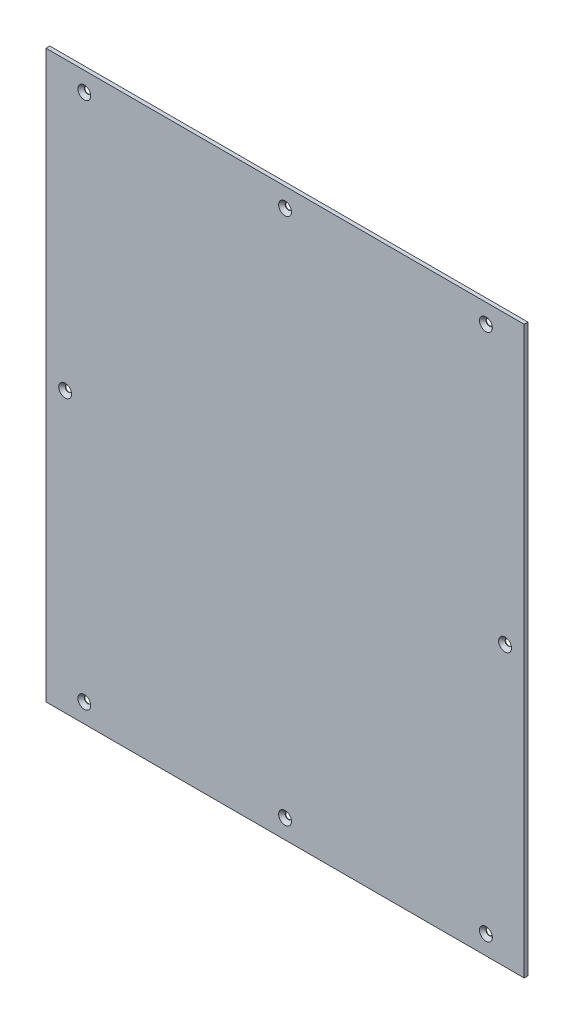
ISO-10303-21;
HEADER;
FILE_DESCRIPTION(('STEP AP214'),'2;1');
FILE_NAME('part.step','',(''),(''),'','','');
FILE_SCHEMA(('AUTOMOTIVE_DESIGN { 1 0 10303 214 1 1 1 1 }'));
ENDSEC;
DATA;
#1=APPLICATION_CONTEXT('core data for automotive mechanical design processes');
#2=APPLICATION_PROTOCOL_DEFINITION('international standard','automotive_design',2000,#1);
#3=PRODUCT_CONTEXT('',#1,'mechanical');
#4=PRODUCT('Part','Part','',(#3));
#5=PRODUCT_RELATED_PRODUCT_CATEGORY('part','',(#4));
#6=PRODUCT_DEFINITION_FORMATION('','',#4);
#7=PRODUCT_DEFINITION_CONTEXT('part definition',#1,'design');
#8=PRODUCT_DEFINITION('design','',#6,#7);
#9=PRODUCT_DEFINITION_SHAPE('','',#8);
#10=(LENGTH_UNIT() NAMED_UNIT(*) SI_UNIT(.MILLI.,.METRE.));
#11=(NAMED_UNIT(*) PLANE_ANGLE_UNIT() SI_UNIT($,.RADIAN.));
#12=(NAMED_UNIT(*) SI_UNIT($,.STERADIAN.) SOLID_ANGLE_UNIT());
#13=UNCERTAINTY_MEASURE_WITH_UNIT(LENGTH_MEASURE(1.E-05),#10,'distance_accuracy_value','');
#14=(GEOMETRIC_REPRESENTATION_CONTEXT(3) GLOBAL_UNCERTAINTY_ASSIGNED_CONTEXT((#13)) GLOBAL_UNIT_ASSIGNED_CONTEXT((#10,
#11,#12)) REPRESENTATION_CONTEXT('',''));
#15=CARTESIAN_POINT('',(0.,0.,0.));
#16=DIRECTION('',(0.,0.,1.));
#17=DIRECTION('',(1.,0.,0.));
#18=AXIS2_PLACEMENT_3D('',#15,#16,#17);
#19=CARTESIAN_POINT('',(0.,0.,4.));
#20=DIRECTION('',(0.,0.,-1.));
#21=DIRECTION('',(-1.,0.,0.));
#22=AXIS2_PLACEMENT_3D('',#19,#20,#21);
#23=PLANE('',#22);
#24=CARTESIAN_POINT('',(-230.,-4.00000000000006,4.));
#25=DIRECTION('',(0.,0.,1.));
#26=DIRECTION('',(1.,0.,0.));
#27=AXIS2_PLACEMENT_3D('',#24,#25,#26);
#28=CIRCLE('',#27,6.72);
#29=CARTESIAN_POINT('',(-223.28,-4.00000000000006,4.));
#30=VERTEX_POINT('',#29);
#31=EDGE_CURVE('E187',#30,#30,#28,.T.);
#32=ORIENTED_EDGE('',*,*,#31,.F.);
#33=EDGE_LOOP('',(#32));
#34=FACE_BOUND('',#33,.T.);
#35=CARTESIAN_POINT('',(-210.,-276.,4.));
#36=DIRECTION('',(0.,0.,1.));
#37=DIRECTION('',(1.,0.,0.));
#38=AXIS2_PLACEMENT_3D('',#35,#36,#37);
#39=CIRCLE('',#38,6.72);
#40=CARTESIAN_POINT('',(-203.28,-276.,4.));
#41=VERTEX_POINT('',#40);
#42=EDGE_CURVE('E169',#41,#41,#39,.T.);
#43=ORIENTED_EDGE('',*,*,#42,.F.);
#44=EDGE_LOOP('',(#43));
#45=FACE_BOUND('',#44,.T.);
#46=CARTESIAN_POINT('',(0.,-276.,4.));
#47=DIRECTION('',(0.,0.,1.));
#48=DIRECTION('',(1.,0.,0.));
#49=AXIS2_PLACEMENT_3D('',#46,#47,#48);
#50=CIRCLE('',#49,6.72);
#51=CARTESIAN_POINT('',(6.72000000000003,-276.,4.));
#52=VERTEX_POINT('',#51);
#53=EDGE_CURVE('E157',#52,#52,#50,.T.);
#54=ORIENTED_EDGE('',*,*,#53,.F.);
#55=EDGE_LOOP('',(#54));
#56=FACE_BOUND('',#55,.T.);
#57=CARTESIAN_POINT('',(210.,-276.,4.));
#58=DIRECTION('',(0.,0.,1.));
#59=DIRECTION('',(1.,0.,0.));
#60=AXIS2_PLACEMENT_3D('',#57,#58,#59);
#61=CIRCLE('',#60,6.72);
#62=CARTESIAN_POINT('',(216.72,-276.,4.));
#63=VERTEX_POINT('',#62);
#64=EDGE_CURVE('E147',#63,#63,#61,.T.);
#65=ORIENTED_EDGE('',*,*,#64,.F.);
#66=EDGE_LOOP('',(#65));
#67=FACE_BOUND('',#66,.T.);
#68=CARTESIAN_POINT('',(210.,276.,4.));
#69=DIRECTION('',(0.,0.,1.));
#70=DIRECTION('',(1.,0.,0.));
#71=AXIS2_PLACEMENT_3D('',#68,#69,#70);
#72=CIRCLE('',#71,6.72);
#73=CARTESIAN_POINT('',(216.72,276.,4.));
#74=VERTEX_POINT('',#73);
#75=EDGE_CURVE('E143',#74,#74,#72,.T.);
#76=ORIENTED_EDGE('',*,*,#75,.F.);
#77=EDGE_LOOP('',(#76));
#78=FACE_BOUND('',#77,.T.);
#79=CARTESIAN_POINT('',(0.,276.,4.));
#80=DIRECTION('',(0.,0.,1.));
#81=DIRECTION('',(1.,0.,0.));
#82=AXIS2_PLACEMENT_3D('',#79,#80,#81);
#83=CIRCLE('',#82,6.72);
#84=CARTESIAN_POINT('',(6.71999999999997,276.,4.));
#85=VERTEX_POINT('',#84);
#86=EDGE_CURVE('E135',#85,#85,#83,.T.);
#87=ORIENTED_EDGE('',*,*,#86,.F.);
#88=EDGE_LOOP('',(#87));
#89=FACE_BOUND('',#88,.T.);
#90=CARTESIAN_POINT('',(-210.,276.,4.));
#91=DIRECTION('',(0.,0.,1.));
#92=DIRECTION('',(1.,0.,0.));
#93=AXIS2_PLACEMENT_3D('',#90,#91,#92);
#94=CIRCLE('',#93,6.72);
#95=CARTESIAN_POINT('',(-203.28,276.,4.));
#96=VERTEX_POINT('',#95);
#97=EDGE_CURVE('E121',#96,#96,#94,.T.);
#98=ORIENTED_EDGE('',*,*,#97,.F.);
#99=EDGE_LOOP('',(#98));
#100=FACE_BOUND('',#99,.T.);
#101=DIRECTION('',(0.,1.,0.));
#102=VECTOR('',#101,1.);
#103=CARTESIAN_POINT('',(250.,-296.,4.));
#104=LINE('',#103,#102);
#105=CARTESIAN_POINT('',(250.,-296.,4.));
#106=VERTEX_POINT('',#105);
#107=CARTESIAN_POINT('',(250.,296.,4.));
#108=VERTEX_POINT('',#107);
#109=EDGE_CURVE('E93',#106,#108,#104,.T.);
#110=ORIENTED_EDGE('',*,*,#109,.T.);
#111=DIRECTION('',(-1.,0.,0.));
#112=VECTOR('',#111,1.);
#113=CARTESIAN_POINT('',(-250.,296.,4.));
#114=LINE('',#113,#112);
#115=CARTESIAN_POINT('',(-250.,296.,4.));
#116=VERTEX_POINT('',#115);
#117=EDGE_CURVE('E88',#108,#116,#114,.T.);
#118=ORIENTED_EDGE('',*,*,#117,.T.);
#119=DIRECTION('',(0.,-1.,0.));
#120=VECTOR('',#119,1.);
#121=CARTESIAN_POINT('',(-250.,-296.,4.));
#122=LINE('',#121,#120);
#123=CARTESIAN_POINT('',(-250.,-296.,4.));
#124=VERTEX_POINT('',#123);
#125=EDGE_CURVE('E90',#116,#124,#122,.T.);
#126=ORIENTED_EDGE('',*,*,#125,.T.);
#127=DIRECTION('',(1.,0.,0.));
#128=VECTOR('',#127,1.);
#129=CARTESIAN_POINT('',(-250.,-296.,4.));
#130=LINE('',#129,#128);
#131=EDGE_CURVE('E57',#124,#106,#130,.T.);
#132=ORIENTED_EDGE('',*,*,#131,.T.);
#133=EDGE_LOOP('',(#110,#118,#126,#132));
#134=FACE_BOUND('',#133,.T.);
#135=CARTESIAN_POINT('',(230.,-4.00000000000006,4.));
#136=DIRECTION('',(0.,0.,1.));
#137=DIRECTION('',(1.,0.,0.));
#138=AXIS2_PLACEMENT_3D('',#135,#136,#137);
#139=CIRCLE('',#138,6.72);
#140=CARTESIAN_POINT('',(236.72,-4.00000000000006,4.));
#141=VERTEX_POINT('',#140);
#142=EDGE_CURVE('E180',#141,#141,#139,.T.);
#143=ORIENTED_EDGE('',*,*,#142,.F.);
#144=EDGE_LOOP('',(#143));
#145=FACE_BOUND('',#144,.T.);
#146=ADVANCED_FACE('F39',(#34,#45,#56,#67,#78,#89,#100,#134,#145),#23,.F.);
#147=CARTESIAN_POINT('',(0.,0.,0.));
#148=DIRECTION('',(0.,0.,-1.));
#149=DIRECTION('',(-1.,0.,0.));
#150=AXIS2_PLACEMENT_3D('',#147,#148,#149);
#151=PLANE('',#150);
#152=CARTESIAN_POINT('',(-230.,-4.00000000000006,0.));
#153=DIRECTION('',(0.,0.,1.));
#154=DIRECTION('',(1.,0.,0.));
#155=AXIS2_PLACEMENT_3D('',#152,#153,#154);
#156=CIRCLE('',#155,3.3);
#157=CARTESIAN_POINT('',(-226.7,-4.00000000000006,0.));
#158=VERTEX_POINT('',#157);
#159=EDGE_CURVE('E177',#158,#158,#156,.T.);
#160=ORIENTED_EDGE('',*,*,#159,.T.);
#161=EDGE_LOOP('',(#160));
#162=FACE_BOUND('',#161,.T.);
#163=CARTESIAN_POINT('',(230.,-4.00000000000006,0.));
#164=DIRECTION('',(0.,0.,1.));
#165=DIRECTION('',(1.,0.,0.));
#166=AXIS2_PLACEMENT_3D('',#163,#164,#165);
#167=CIRCLE('',#166,3.3);
#168=CARTESIAN_POINT('',(233.3,-4.00000000000006,0.));
#169=VERTEX_POINT('',#168);
#170=EDGE_CURVE('E172',#169,#169,#167,.T.);
#171=ORIENTED_EDGE('',*,*,#170,.T.);
#172=EDGE_LOOP('',(#171));
#173=FACE_BOUND('',#172,.T.);
#174=CARTESIAN_POINT('',(-210.,-276.,0.));
#175=DIRECTION('',(0.,0.,1.));
#176=DIRECTION('',(1.,0.,0.));
#177=AXIS2_PLACEMENT_3D('',#174,#175,#176);
#178=CIRCLE('',#177,3.3);
#179=CARTESIAN_POINT('',(-206.7,-276.,0.));
#180=VERTEX_POINT('',#179);
#181=EDGE_CURVE('E165',#180,#180,#178,.T.);
#182=ORIENTED_EDGE('',*,*,#181,.T.);
#183=EDGE_LOOP('',(#182));
#184=FACE_BOUND('',#183,.T.);
#185=DIRECTION('',(0.,1.,0.));
#186=VECTOR('',#185,1.);
#187=CARTESIAN_POINT('',(250.,-296.,0.));
#188=LINE('',#187,#186);
#189=CARTESIAN_POINT('',(250.,-296.,0.));
#190=VERTEX_POINT('',#189);
#191=CARTESIAN_POINT('',(250.,296.,0.));
#192=VERTEX_POINT('',#191);
#193=EDGE_CURVE('E103',#190,#192,#188,.T.);
#194=ORIENTED_EDGE('',*,*,#193,.F.);
#195=DIRECTION('',(1.,0.,0.));
#196=VECTOR('',#195,1.);
#197=CARTESIAN_POINT('',(-250.,-296.,0.));
#198=LINE('',#197,#196);
#199=CARTESIAN_POINT('',(-250.,-296.,0.));
#200=VERTEX_POINT('',#199);
#201=EDGE_CURVE('E79',#200,#190,#198,.T.);
#202=ORIENTED_EDGE('',*,*,#201,.F.);
#203=DIRECTION('',(0.,-1.,0.));
#204=VECTOR('',#203,1.);
#205=CARTESIAN_POINT('',(-250.,-296.,0.));
#206=LINE('',#205,#204);
#207=CARTESIAN_POINT('',(-250.,296.,0.));
#208=VERTEX_POINT('',#207);
#209=EDGE_CURVE('E71',#208,#200,#206,.T.);
#210=ORIENTED_EDGE('',*,*,#209,.F.);
#211=DIRECTION('',(-1.,0.,0.));
#212=VECTOR('',#211,1.);
#213=CARTESIAN_POINT('',(-250.,296.,0.));
#214=LINE('',#213,#212);
#215=EDGE_CURVE('E92',#192,#208,#214,.T.);
#216=ORIENTED_EDGE('',*,*,#215,.F.);
#217=EDGE_LOOP('',(#194,#202,#210,#216));
#218=FACE_BOUND('',#217,.T.);
#219=CARTESIAN_POINT('',(-210.,276.,0.));
#220=DIRECTION('',(0.,0.,1.));
#221=DIRECTION('',(1.,0.,0.));
#222=AXIS2_PLACEMENT_3D('',#219,#220,#221);
#223=CIRCLE('',#222,3.3);
#224=CARTESIAN_POINT('',(-206.7,276.,0.));
#225=VERTEX_POINT('',#224);
#226=EDGE_CURVE('E106',#225,#225,#223,.T.);
#227=ORIENTED_EDGE('',*,*,#226,.T.);
#228=EDGE_LOOP('',(#227));
#229=FACE_BOUND('',#228,.T.);
#230=CARTESIAN_POINT('',(0.,276.,0.));
#231=DIRECTION('',(0.,0.,1.));
#232=DIRECTION('',(1.,0.,0.));
#233=AXIS2_PLACEMENT_3D('',#230,#231,#232);
#234=CIRCLE('',#233,3.3);
#235=CARTESIAN_POINT('',(3.29999999999997,276.,0.));
#236=VERTEX_POINT('',#235);
#237=EDGE_CURVE('E127',#236,#236,#234,.T.);
#238=ORIENTED_EDGE('',*,*,#237,.T.);
#239=EDGE_LOOP('',(#238));
#240=FACE_BOUND('',#239,.T.);
#241=CARTESIAN_POINT('',(210.,276.,0.));
#242=DIRECTION('',(0.,0.,1.));
#243=DIRECTION('',(1.,0.,0.));
#244=AXIS2_PLACEMENT_3D('',#241,#242,#243);
#245=CIRCLE('',#244,3.3);
#246=CARTESIAN_POINT('',(213.3,276.,0.));
#247=VERTEX_POINT('',#246);
#248=EDGE_CURVE('E131',#247,#247,#245,.T.);
#249=ORIENTED_EDGE('',*,*,#248,.T.);
#250=EDGE_LOOP('',(#249));
#251=FACE_BOUND('',#250,.T.);
#252=CARTESIAN_POINT('',(210.,-276.,0.));
#253=DIRECTION('',(0.,0.,1.));
#254=DIRECTION('',(1.,0.,0.));
#255=AXIS2_PLACEMENT_3D('',#252,#253,#254);
#256=CIRCLE('',#255,3.3);
#257=CARTESIAN_POINT('',(213.3,-276.,0.));
#258=VERTEX_POINT('',#257);
#259=EDGE_CURVE('E145',#258,#258,#256,.T.);
#260=ORIENTED_EDGE('',*,*,#259,.T.);
#261=EDGE_LOOP('',(#260));
#262=FACE_BOUND('',#261,.T.);
#263=CARTESIAN_POINT('',(0.,-276.,0.));
#264=DIRECTION('',(0.,0.,1.));
#265=DIRECTION('',(1.,0.,0.));
#266=AXIS2_PLACEMENT_3D('',#263,#264,#265);
#267=CIRCLE('',#266,3.3);
#268=CARTESIAN_POINT('',(3.30000000000003,-276.,0.));
#269=VERTEX_POINT('',#268);
#270=EDGE_CURVE('E153',#269,#269,#267,.T.);
#271=ORIENTED_EDGE('',*,*,#270,.T.);
#272=EDGE_LOOP('',(#271));
#273=FACE_BOUND('',#272,.T.);
#274=ADVANCED_FACE('F111',(#162,#173,#184,#218,#229,#240,#251,#262,#273),#151,.T.);
#275=CARTESIAN_POINT('',(250.,-296.,4.));
#276=DIRECTION('',(-1.,0.,0.));
#277=DIRECTION('',(0.,0.,1.));
#278=AXIS2_PLACEMENT_3D('',#275,#276,#277);
#279=PLANE('',#278);
#280=ORIENTED_EDGE('',*,*,#193,.T.);
#281=DIRECTION('',(0.,0.,-1.));
#282=VECTOR('',#281,1.);
#283=CARTESIAN_POINT('',(250.,296.,4.));
#284=LINE('',#283,#282);
#285=EDGE_CURVE('E11',#108,#192,#284,.T.);
#286=ORIENTED_EDGE('',*,*,#285,.F.);
#287=ORIENTED_EDGE('',*,*,#109,.F.);
#288=DIRECTION('',(0.,0.,-1.));
#289=VECTOR('',#288,1.);
#290=CARTESIAN_POINT('',(250.,-296.,4.));
#291=LINE('',#290,#289);
#292=EDGE_CURVE('E97',#106,#190,#291,.T.);
#293=ORIENTED_EDGE('',*,*,#292,.T.);
#294=EDGE_LOOP('',(#280,#286,#287,#293));
#295=FACE_BOUND('',#294,.T.);
#296=ADVANCED_FACE('F41',(#295),#279,.F.);
#297=CARTESIAN_POINT('',(-250.,296.,4.));
#298=DIRECTION('',(0.,-1.,0.));
#299=DIRECTION('',(0.,0.,-1.));
#300=AXIS2_PLACEMENT_3D('',#297,#298,#299);
#301=PLANE('',#300);
#302=ORIENTED_EDGE('',*,*,#215,.T.);
#303=DIRECTION('',(0.,0.,-1.));
#304=VECTOR('',#303,1.);
#305=CARTESIAN_POINT('',(-250.,296.,4.));
#306=LINE('',#305,#304);
#307=EDGE_CURVE('E48',#116,#208,#306,.T.);
#308=ORIENTED_EDGE('',*,*,#307,.F.);
#309=ORIENTED_EDGE('',*,*,#117,.F.);
#310=ORIENTED_EDGE('',*,*,#285,.T.);
#311=EDGE_LOOP('',(#302,#308,#309,#310));
#312=FACE_BOUND('',#311,.T.);
#313=ADVANCED_FACE('F94',(#312),#301,.F.);
#314=CARTESIAN_POINT('',(-250.,-296.,4.));
#315=DIRECTION('',(1.,0.,0.));
#316=DIRECTION('',(0.,0.,-1.));
#317=AXIS2_PLACEMENT_3D('',#314,#315,#316);
#318=PLANE('',#317);
#319=ORIENTED_EDGE('',*,*,#209,.T.);
#320=DIRECTION('',(0.,0.,-1.));
#321=VECTOR('',#320,1.);
#322=CARTESIAN_POINT('',(-250.,-296.,4.));
#323=LINE('',#322,#321);
#324=EDGE_CURVE('E96',#124,#200,#323,.T.);
#325=ORIENTED_EDGE('',*,*,#324,.F.);
#326=ORIENTED_EDGE('',*,*,#125,.F.);
#327=ORIENTED_EDGE('',*,*,#307,.T.);
#328=EDGE_LOOP('',(#319,#325,#326,#327));
#329=FACE_BOUND('',#328,.T.);
#330=ADVANCED_FACE('F100',(#329),#318,.F.);
#331=CARTESIAN_POINT('',(-250.,-296.,4.));
#332=DIRECTION('',(0.,1.,0.));
#333=DIRECTION('',(0.,0.,1.));
#334=AXIS2_PLACEMENT_3D('',#331,#332,#333);
#335=PLANE('',#334);
#336=ORIENTED_EDGE('',*,*,#201,.T.);
#337=ORIENTED_EDGE('',*,*,#292,.F.);
#338=ORIENTED_EDGE('',*,*,#131,.F.);
#339=ORIENTED_EDGE('',*,*,#324,.T.);
#340=EDGE_LOOP('',(#336,#337,#338,#339));
#341=FACE_BOUND('',#340,.T.);
#342=ADVANCED_FACE('F112',(#341),#335,.F.);
#343=CARTESIAN_POINT('',(-210.,276.,4.));
#344=DIRECTION('',(0.,0.,1.));
#345=DIRECTION('',(1.,0.,0.));
#346=AXIS2_PLACEMENT_3D('',#343,#344,#345);
#347=CYLINDRICAL_SURFACE('',#346,3.3);
#348=ORIENTED_EDGE('',*,*,#226,.F.);
#349=EDGE_LOOP('',(#348));
#350=FACE_BOUND('',#349,.T.);
#351=CARTESIAN_POINT('',(-210.,276.,0.579999999999994));
#352=DIRECTION('',(0.,0.,1.));
#353=DIRECTION('',(1.,0.,0.));
#354=AXIS2_PLACEMENT_3D('',#351,#352,#353);
#355=CIRCLE('',#354,3.3);
#356=CARTESIAN_POINT('',(-206.7,276.,0.579999999999994));
#357=VERTEX_POINT('',#356);
#358=EDGE_CURVE('E116',#357,#357,#355,.T.);
#359=ORIENTED_EDGE('',*,*,#358,.T.);
#360=EDGE_LOOP('',(#359));
#361=FACE_BOUND('',#360,.T.);
#362=ADVANCED_FACE('F209',(#350,#361),#347,.F.);
#363=CARTESIAN_POINT('',(-210.,276.,4.));
#364=DIRECTION('',(0.,0.,1.));
#365=DIRECTION('',(1.,0.,0.));
#366=AXIS2_PLACEMENT_3D('',#363,#364,#365);
#367=CONICAL_SURFACE('',#366,6.72,0.785398163397448);
#368=ORIENTED_EDGE('',*,*,#358,.F.);
#369=EDGE_LOOP('',(#368));
#370=FACE_BOUND('',#369,.T.);
#371=ORIENTED_EDGE('',*,*,#97,.T.);
#372=EDGE_LOOP('',(#371));
#373=FACE_BOUND('',#372,.T.);
#374=ADVANCED_FACE('F210',(#370,#373),#367,.F.);
#375=CARTESIAN_POINT('',(0.,276.,4.));
#376=DIRECTION('',(0.,0.,1.));
#377=DIRECTION('',(1.,0.,0.));
#378=AXIS2_PLACEMENT_3D('',#375,#376,#377);
#379=CYLINDRICAL_SURFACE('',#378,3.3);
#380=ORIENTED_EDGE('',*,*,#237,.F.);
#381=EDGE_LOOP('',(#380));
#382=FACE_BOUND('',#381,.T.);
#383=CARTESIAN_POINT('',(0.,276.,0.579999999999994));
#384=DIRECTION('',(0.,0.,1.));
#385=DIRECTION('',(1.,0.,0.));
#386=AXIS2_PLACEMENT_3D('',#383,#384,#385);
#387=CIRCLE('',#386,3.3);
#388=CARTESIAN_POINT('',(3.29999999999996,276.,0.579999999999994));
#389=VERTEX_POINT('',#388);
#390=EDGE_CURVE('E129',#389,#389,#387,.T.);
#391=ORIENTED_EDGE('',*,*,#390,.T.);
#392=EDGE_LOOP('',(#391));
#393=FACE_BOUND('',#392,.T.);
#394=ADVANCED_FACE('F207',(#382,#393),#379,.F.);
#395=CARTESIAN_POINT('',(0.,276.,4.));
#396=DIRECTION('',(0.,0.,1.));
#397=DIRECTION('',(1.,0.,0.));
#398=AXIS2_PLACEMENT_3D('',#395,#396,#397);
#399=CONICAL_SURFACE('',#398,6.72,0.785398163397448);
#400=ORIENTED_EDGE('',*,*,#390,.F.);
#401=EDGE_LOOP('',(#400));
#402=FACE_BOUND('',#401,.T.);
#403=ORIENTED_EDGE('',*,*,#86,.T.);
#404=EDGE_LOOP('',(#403));
#405=FACE_BOUND('',#404,.T.);
#406=ADVANCED_FACE('F220',(#402,#405),#399,.F.);
#407=CARTESIAN_POINT('',(210.,276.,4.));
#408=DIRECTION('',(0.,0.,1.));
#409=DIRECTION('',(1.,0.,0.));
#410=AXIS2_PLACEMENT_3D('',#407,#408,#409);
#411=CYLINDRICAL_SURFACE('',#410,3.3);
#412=ORIENTED_EDGE('',*,*,#248,.F.);
#413=EDGE_LOOP('',(#412));
#414=FACE_BOUND('',#413,.T.);
#415=CARTESIAN_POINT('',(210.,276.,0.579999999999994));
#416=DIRECTION('',(0.,0.,1.));
#417=DIRECTION('',(1.,0.,0.));
#418=AXIS2_PLACEMENT_3D('',#415,#416,#417);
#419=CIRCLE('',#418,3.3);
#420=CARTESIAN_POINT('',(213.3,276.,0.579999999999994));
#421=VERTEX_POINT('',#420);
#422=EDGE_CURVE('E136',#421,#421,#419,.T.);
#423=ORIENTED_EDGE('',*,*,#422,.T.);
#424=EDGE_LOOP('',(#423));
#425=FACE_BOUND('',#424,.T.);
#426=ADVANCED_FACE('F289',(#414,#425),#411,.F.);
#427=CARTESIAN_POINT('',(210.,276.,4.));
#428=DIRECTION('',(0.,0.,1.));
#429=DIRECTION('',(1.,0.,0.));
#430=AXIS2_PLACEMENT_3D('',#427,#428,#429);
#431=CONICAL_SURFACE('',#430,6.72,0.785398163397448);
#432=ORIENTED_EDGE('',*,*,#422,.F.);
#433=EDGE_LOOP('',(#432));
#434=FACE_BOUND('',#433,.T.);
#435=ORIENTED_EDGE('',*,*,#75,.T.);
#436=EDGE_LOOP('',(#435));
#437=FACE_BOUND('',#436,.T.);
#438=ADVANCED_FACE('F298',(#434,#437),#431,.F.);
#439=CARTESIAN_POINT('',(210.,-276.,4.));
#440=DIRECTION('',(0.,0.,1.));
#441=DIRECTION('',(1.,0.,0.));
#442=AXIS2_PLACEMENT_3D('',#439,#440,#441);
#443=CYLINDRICAL_SURFACE('',#442,3.3);
#444=ORIENTED_EDGE('',*,*,#259,.F.);
#445=EDGE_LOOP('',(#444));
#446=FACE_BOUND('',#445,.T.);
#447=CARTESIAN_POINT('',(210.,-276.,0.579999999999994));
#448=DIRECTION('',(0.,0.,1.));
#449=DIRECTION('',(1.,0.,0.));
#450=AXIS2_PLACEMENT_3D('',#447,#448,#449);
#451=CIRCLE('',#450,3.3);
#452=CARTESIAN_POINT('',(213.3,-276.,0.579999999999994));
#453=VERTEX_POINT('',#452);
#454=EDGE_CURVE('E150',#453,#453,#451,.T.);
#455=ORIENTED_EDGE('',*,*,#454,.T.);
#456=EDGE_LOOP('',(#455));
#457=FACE_BOUND('',#456,.T.);
#458=ADVANCED_FACE('F306',(#446,#457),#443,.F.);
#459=CARTESIAN_POINT('',(210.,-276.,4.));
#460=DIRECTION('',(0.,0.,1.));
#461=DIRECTION('',(1.,0.,0.));
#462=AXIS2_PLACEMENT_3D('',#459,#460,#461);
#463=CONICAL_SURFACE('',#462,6.72,0.785398163397448);
#464=ORIENTED_EDGE('',*,*,#454,.F.);
#465=EDGE_LOOP('',(#464));
#466=FACE_BOUND('',#465,.T.);
#467=ORIENTED_EDGE('',*,*,#64,.T.);
#468=EDGE_LOOP('',(#467));
#469=FACE_BOUND('',#468,.T.);
#470=ADVANCED_FACE('F318',(#466,#469),#463,.F.);
#471=CARTESIAN_POINT('',(0.,-276.,4.));
#472=DIRECTION('',(0.,0.,1.));
#473=DIRECTION('',(1.,0.,0.));
#474=AXIS2_PLACEMENT_3D('',#471,#472,#473);
#475=CYLINDRICAL_SURFACE('',#474,3.3);
#476=ORIENTED_EDGE('',*,*,#270,.F.);
#477=EDGE_LOOP('',(#476));
#478=FACE_BOUND('',#477,.T.);
#479=CARTESIAN_POINT('',(0.,-276.,0.579999999999994));
#480=DIRECTION('',(0.,0.,1.));
#481=DIRECTION('',(1.,0.,0.));
#482=AXIS2_PLACEMENT_3D('',#479,#480,#481);
#483=CIRCLE('',#482,3.3);
#484=CARTESIAN_POINT('',(3.30000000000003,-276.,0.579999999999994));
#485=VERTEX_POINT('',#484);
#486=EDGE_CURVE('E156',#485,#485,#483,.T.);
#487=ORIENTED_EDGE('',*,*,#486,.T.);
#488=EDGE_LOOP('',(#487));
#489=FACE_BOUND('',#488,.T.);
#490=ADVANCED_FACE('F327',(#478,#489),#475,.F.);
#491=CARTESIAN_POINT('',(0.,-276.,4.));
#492=DIRECTION('',(0.,0.,1.));
#493=DIRECTION('',(1.,0.,0.));
#494=AXIS2_PLACEMENT_3D('',#491,#492,#493);
#495=CONICAL_SURFACE('',#494,6.72,0.785398163397448);
#496=ORIENTED_EDGE('',*,*,#486,.F.);
#497=EDGE_LOOP('',(#496));
#498=FACE_BOUND('',#497,.T.);
#499=ORIENTED_EDGE('',*,*,#53,.T.);
#500=EDGE_LOOP('',(#499));
#501=FACE_BOUND('',#500,.T.);
#502=ADVANCED_FACE('F338',(#498,#501),#495,.F.);
#503=CARTESIAN_POINT('',(-210.,-276.,4.));
#504=DIRECTION('',(0.,0.,1.));
#505=DIRECTION('',(1.,0.,0.));
#506=AXIS2_PLACEMENT_3D('',#503,#504,#505);
#507=CYLINDRICAL_SURFACE('',#506,3.3);
#508=ORIENTED_EDGE('',*,*,#181,.F.);
#509=EDGE_LOOP('',(#508));
#510=FACE_BOUND('',#509,.T.);
#511=CARTESIAN_POINT('',(-210.,-276.,0.579999999999994));
#512=DIRECTION('',(0.,0.,1.));
#513=DIRECTION('',(1.,0.,0.));
#514=AXIS2_PLACEMENT_3D('',#511,#512,#513);
#515=CIRCLE('',#514,3.3);
#516=CARTESIAN_POINT('',(-206.7,-276.,0.579999999999994));
#517=VERTEX_POINT('',#516);
#518=EDGE_CURVE('E164',#517,#517,#515,.T.);
#519=ORIENTED_EDGE('',*,*,#518,.T.);
#520=EDGE_LOOP('',(#519));
#521=FACE_BOUND('',#520,.T.);
#522=ADVANCED_FACE('F346',(#510,#521),#507,.F.);
#523=CARTESIAN_POINT('',(-210.,-276.,4.));
#524=DIRECTION('',(0.,0.,1.));
#525=DIRECTION('',(1.,0.,0.));
#526=AXIS2_PLACEMENT_3D('',#523,#524,#525);
#527=CONICAL_SURFACE('',#526,6.72,0.785398163397448);
#528=ORIENTED_EDGE('',*,*,#518,.F.);
#529=EDGE_LOOP('',(#528));
#530=FACE_BOUND('',#529,.T.);
#531=ORIENTED_EDGE('',*,*,#42,.T.);
#532=EDGE_LOOP('',(#531));
#533=FACE_BOUND('',#532,.T.);
#534=ADVANCED_FACE('F356',(#530,#533),#527,.F.);
#535=CARTESIAN_POINT('',(230.,-4.00000000000006,4.));
#536=DIRECTION('',(0.,0.,1.));
#537=DIRECTION('',(1.,0.,0.));
#538=AXIS2_PLACEMENT_3D('',#535,#536,#537);
#539=CYLINDRICAL_SURFACE('',#538,3.3);
#540=ORIENTED_EDGE('',*,*,#170,.F.);
#541=EDGE_LOOP('',(#540));
#542=FACE_BOUND('',#541,.T.);
#543=CARTESIAN_POINT('',(230.,-4.00000000000006,0.579999999999994));
#544=DIRECTION('',(0.,0.,1.));
#545=DIRECTION('',(1.,0.,0.));
#546=AXIS2_PLACEMENT_3D('',#543,#544,#545);
#547=CIRCLE('',#546,3.3);
#548=CARTESIAN_POINT('',(233.3,-4.00000000000006,0.579999999999994));
#549=VERTEX_POINT('',#548);
#550=EDGE_CURVE('E174',#549,#549,#547,.T.);
#551=ORIENTED_EDGE('',*,*,#550,.T.);
#552=EDGE_LOOP('',(#551));
#553=FACE_BOUND('',#552,.T.);
#554=ADVANCED_FACE('F366',(#542,#553),#539,.F.);
#555=CARTESIAN_POINT('',(230.,-4.00000000000006,4.));
#556=DIRECTION('',(0.,0.,1.));
#557=DIRECTION('',(1.,0.,0.));
#558=AXIS2_PLACEMENT_3D('',#555,#556,#557);
#559=CONICAL_SURFACE('',#558,6.72,0.785398163397448);
#560=ORIENTED_EDGE('',*,*,#550,.F.);
#561=EDGE_LOOP('',(#560));
#562=FACE_BOUND('',#561,.T.);
#563=ORIENTED_EDGE('',*,*,#142,.T.);
#564=EDGE_LOOP('',(#563));
#565=FACE_BOUND('',#564,.T.);
#566=ADVANCED_FACE('F378',(#562,#565),#559,.F.);
#567=CARTESIAN_POINT('',(-230.,-4.00000000000006,4.));
#568=DIRECTION('',(0.,0.,1.));
#569=DIRECTION('',(1.,0.,0.));
#570=AXIS2_PLACEMENT_3D('',#567,#568,#569);
#571=CYLINDRICAL_SURFACE('',#570,3.3);
#572=ORIENTED_EDGE('',*,*,#159,.F.);
#573=EDGE_LOOP('',(#572));
#574=FACE_BOUND('',#573,.T.);
#575=CARTESIAN_POINT('',(-230.,-4.00000000000006,0.579999999999994));
#576=DIRECTION('',(0.,0.,1.));
#577=DIRECTION('',(1.,0.,0.));
#578=AXIS2_PLACEMENT_3D('',#575,#576,#577);
#579=CIRCLE('',#578,3.3);
#580=CARTESIAN_POINT('',(-226.7,-4.00000000000006,0.579999999999994));
#581=VERTEX_POINT('',#580);
#582=EDGE_CURVE('E181',#581,#581,#579,.T.);
#583=ORIENTED_EDGE('',*,*,#582,.T.);
#584=EDGE_LOOP('',(#583));
#585=FACE_BOUND('',#584,.T.);
#586=ADVANCED_FACE('F389',(#574,#585),#571,.F.);
#587=CARTESIAN_POINT('',(-230.,-4.00000000000006,4.));
#588=DIRECTION('',(0.,0.,1.));
#589=DIRECTION('',(1.,0.,0.));
#590=AXIS2_PLACEMENT_3D('',#587,#588,#589);
#591=CONICAL_SURFACE('',#590,6.72,0.785398163397448);
#592=ORIENTED_EDGE('',*,*,#582,.F.);
#593=EDGE_LOOP('',(#592));
#594=FACE_BOUND('',#593,.T.);
#595=ORIENTED_EDGE('',*,*,#31,.T.);
#596=EDGE_LOOP('',(#595));
#597=FACE_BOUND('',#596,.T.);
#598=ADVANCED_FACE('F186',(#594,#597),#591,.F.);
#599=CLOSED_SHELL('',(#146,#274,#296,#313,#330,#342,#362,#374,#394,#406,#426,#438,#458,#470,
#490,#502,#522,#534,#554,#566,#586,#598));
#600=MANIFOLD_SOLID_BREP('B2',#599);
#601=ADVANCED_BREP_SHAPE_REPRESENTATION('',(#18,#600),#14);
#602=SHAPE_DEFINITION_REPRESENTATION(#9,#601);
ENDSEC;
END-ISO-10303-21;
